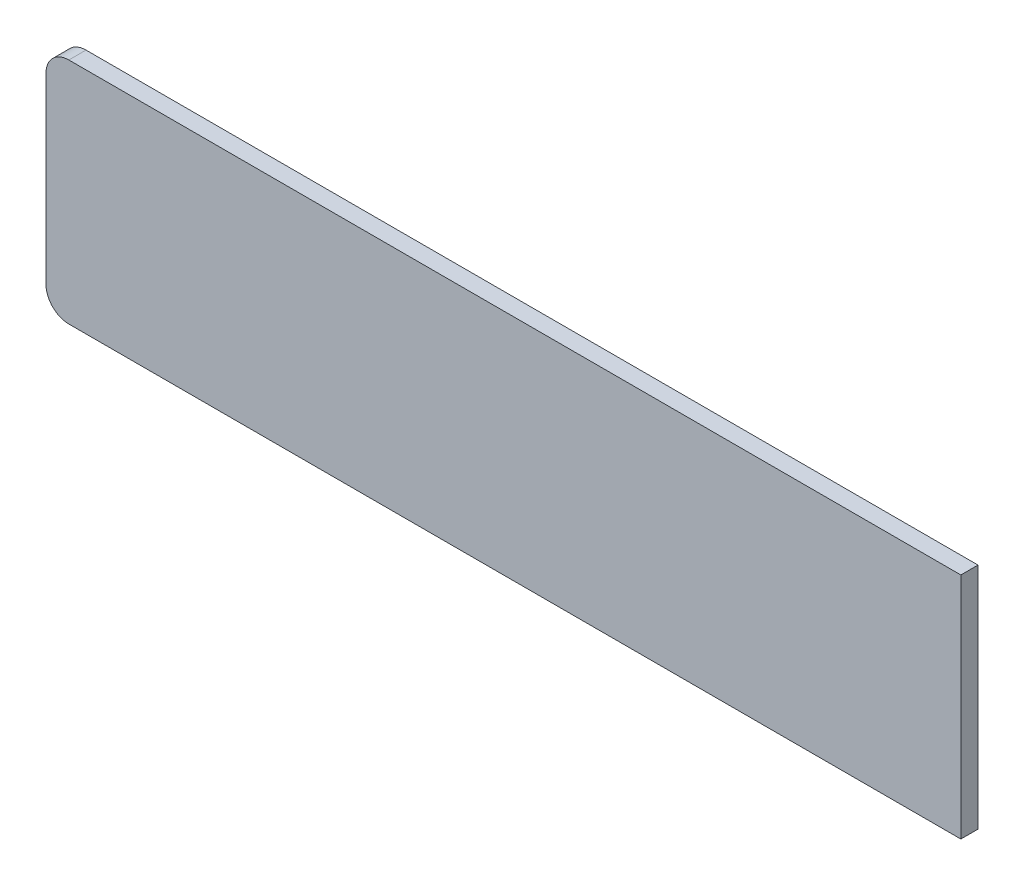
ISO-10303-21;
HEADER;
FILE_DESCRIPTION(('STEP AP214'),'2;1');
FILE_NAME('part.step','',(''),(''),'','','');
FILE_SCHEMA(('AUTOMOTIVE_DESIGN { 1 0 10303 214 1 1 1 1 }'));
ENDSEC;
DATA;
#1=APPLICATION_CONTEXT('core data for automotive mechanical design processes');
#2=APPLICATION_PROTOCOL_DEFINITION('international standard','automotive_design',2000,#1);
#3=PRODUCT_CONTEXT('',#1,'mechanical');
#4=PRODUCT('Part','Part','',(#3));
#5=PRODUCT_RELATED_PRODUCT_CATEGORY('part','',(#4));
#6=PRODUCT_DEFINITION_FORMATION('','',#4);
#7=PRODUCT_DEFINITION_CONTEXT('part definition',#1,'design');
#8=PRODUCT_DEFINITION('design','',#6,#7);
#9=PRODUCT_DEFINITION_SHAPE('','',#8);
#10=(LENGTH_UNIT() NAMED_UNIT(*) SI_UNIT(.MILLI.,.METRE.));
#11=(NAMED_UNIT(*) PLANE_ANGLE_UNIT() SI_UNIT($,.RADIAN.));
#12=(NAMED_UNIT(*) SI_UNIT($,.STERADIAN.) SOLID_ANGLE_UNIT());
#13=UNCERTAINTY_MEASURE_WITH_UNIT(LENGTH_MEASURE(1.E-05),#10,'distance_accuracy_value','');
#14=(GEOMETRIC_REPRESENTATION_CONTEXT(3) GLOBAL_UNCERTAINTY_ASSIGNED_CONTEXT((#13)) GLOBAL_UNIT_ASSIGNED_CONTEXT((#10,
#11,#12)) REPRESENTATION_CONTEXT('',''));
#15=CARTESIAN_POINT('',(0.,0.,0.));
#16=DIRECTION('',(0.,0.,1.));
#17=DIRECTION('',(1.,0.,0.));
#18=AXIS2_PLACEMENT_3D('',#15,#16,#17);
#19=CARTESIAN_POINT('',(-14.951511498347,44.1656930973387,1.5));
#20=DIRECTION('',(-1.,0.,0.));
#21=DIRECTION('',(0.,0.,1.));
#22=AXIS2_PLACEMENT_3D('',#19,#20,#21);
#23=PLANE('',#22);
#24=DIRECTION('',(0.,1.,0.));
#25=VECTOR('',#24,1.);
#26=CARTESIAN_POINT('',(-14.951511498347,44.1656930973387,0.));
#27=LINE('',#26,#25);
#28=CARTESIAN_POINT('',(-14.951511498347,24.1656930973387,0.));
#29=VERTEX_POINT('',#28);
#30=CARTESIAN_POINT('',(-14.951511498347,44.1656930973387,0.));
#31=VERTEX_POINT('',#30);
#32=EDGE_CURVE('E124',#29,#31,#27,.T.);
#33=ORIENTED_EDGE('',*,*,#32,.T.);
#34=DIRECTION('',(0.,0.,-1.));
#35=VECTOR('',#34,1.);
#36=CARTESIAN_POINT('',(-14.951511498347,44.1656930973387,1.5));
#37=LINE('',#36,#35);
#38=CARTESIAN_POINT('',(-14.951511498347,44.1656930973387,1.5));
#39=VERTEX_POINT('',#38);
#40=EDGE_CURVE('E11',#39,#31,#37,.T.);
#41=ORIENTED_EDGE('',*,*,#40,.F.);
#42=DIRECTION('',(0.,1.,0.));
#43=VECTOR('',#42,1.);
#44=CARTESIAN_POINT('',(-14.951511498347,44.1656930973387,1.5));
#45=LINE('',#44,#43);
#46=CARTESIAN_POINT('',(-14.951511498347,24.1656930973387,1.5));
#47=VERTEX_POINT('',#46);
#48=EDGE_CURVE('E134',#47,#39,#45,.T.);
#49=ORIENTED_EDGE('',*,*,#48,.F.);
#50=DIRECTION('',(0.,0.,-1.));
#51=VECTOR('',#50,1.);
#52=CARTESIAN_POINT('',(-14.951511498347,24.1656930973387,1.5));
#53=LINE('',#52,#51);
#54=EDGE_CURVE('E120',#47,#29,#53,.T.);
#55=ORIENTED_EDGE('',*,*,#54,.T.);
#56=EDGE_LOOP('',(#33,#41,#49,#55));
#57=FACE_BOUND('',#56,.T.);
#58=ADVANCED_FACE('F40',(#57),#23,.F.);
#59=CARTESIAN_POINT('',(-92.9515114983469,44.1656930973387,1.5));
#60=DIRECTION('',(0.,-1.,0.));
#61=DIRECTION('',(0.,0.,-1.));
#62=AXIS2_PLACEMENT_3D('',#59,#60,#61);
#63=PLANE('',#62);
#64=DIRECTION('',(-1.,0.,0.));
#65=VECTOR('',#64,1.);
#66=CARTESIAN_POINT('',(-92.9515114983469,44.1656930973387,0.));
#67=LINE('',#66,#65);
#68=CARTESIAN_POINT('',(-92.9515114983469,44.1656930973387,0.));
#69=VERTEX_POINT('',#68);
#70=EDGE_CURVE('E127',#31,#69,#67,.T.);
#71=ORIENTED_EDGE('',*,*,#70,.T.);
#72=DIRECTION('',(0.,0.,-1.));
#73=VECTOR('',#72,1.);
#74=CARTESIAN_POINT('',(-92.9515114983469,44.1656930973387,1.5));
#75=LINE('',#74,#73);
#76=CARTESIAN_POINT('',(-92.9515114983469,44.1656930973387,1.5));
#77=VERTEX_POINT('',#76);
#78=EDGE_CURVE('E48',#77,#69,#75,.T.);
#79=ORIENTED_EDGE('',*,*,#78,.F.);
#80=DIRECTION('',(-1.,0.,0.));
#81=VECTOR('',#80,1.);
#82=CARTESIAN_POINT('',(-92.9515114983469,44.1656930973387,1.5));
#83=LINE('',#82,#81);
#84=EDGE_CURVE('E93',#39,#77,#83,.T.);
#85=ORIENTED_EDGE('',*,*,#84,.F.);
#86=ORIENTED_EDGE('',*,*,#40,.T.);
#87=EDGE_LOOP('',(#71,#79,#85,#86));
#88=FACE_BOUND('',#87,.T.);
#89=ADVANCED_FACE('F158',(#88),#63,.F.);
#90=CARTESIAN_POINT('',(-92.951511498347,42.1656930973387,1.5));
#91=DIRECTION('',(0.,0.,-1.));
#92=DIRECTION('',(-1.,0.,0.));
#93=AXIS2_PLACEMENT_3D('',#90,#91,#92);
#94=CYLINDRICAL_SURFACE('',#93,2.);
#95=CARTESIAN_POINT('',(-92.951511498347,42.1656930973387,0.));
#96=DIRECTION('',(0.,0.,1.));
#97=DIRECTION('',(1.,0.,0.));
#98=AXIS2_PLACEMENT_3D('',#95,#96,#97);
#99=CIRCLE('',#98,2.);
#100=CARTESIAN_POINT('',(-94.951511498347,42.1656930973387,0.));
#101=VERTEX_POINT('',#100);
#102=EDGE_CURVE('E129',#69,#101,#99,.T.);
#103=ORIENTED_EDGE('',*,*,#102,.T.);
#104=DIRECTION('',(0.,0.,-1.));
#105=VECTOR('',#104,1.);
#106=CARTESIAN_POINT('',(-94.951511498347,42.1656930973387,1.5));
#107=LINE('',#106,#105);
#108=CARTESIAN_POINT('',(-94.951511498347,42.1656930973387,1.5));
#109=VERTEX_POINT('',#108);
#110=EDGE_CURVE('E115',#109,#101,#107,.T.);
#111=ORIENTED_EDGE('',*,*,#110,.F.);
#112=CARTESIAN_POINT('',(-92.951511498347,42.1656930973387,1.5));
#113=DIRECTION('',(0.,0.,1.));
#114=DIRECTION('',(1.,0.,0.));
#115=AXIS2_PLACEMENT_3D('',#112,#113,#114);
#116=CIRCLE('',#115,2.);
#117=EDGE_CURVE('E106',#77,#109,#116,.T.);
#118=ORIENTED_EDGE('',*,*,#117,.F.);
#119=ORIENTED_EDGE('',*,*,#78,.T.);
#120=EDGE_LOOP('',(#103,#111,#118,#119));
#121=FACE_BOUND('',#120,.T.);
#122=ADVANCED_FACE('F140',(#121),#94,.T.);
#123=CARTESIAN_POINT('',(-94.951511498347,42.1656930973387,1.5));
#124=DIRECTION('',(1.,0.,0.));
#125=DIRECTION('',(0.,0.,-1.));
#126=AXIS2_PLACEMENT_3D('',#123,#124,#125);
#127=PLANE('',#126);
#128=DIRECTION('',(0.,-1.,0.));
#129=VECTOR('',#128,1.);
#130=CARTESIAN_POINT('',(-94.951511498347,42.1656930973387,0.));
#131=LINE('',#130,#129);
#132=CARTESIAN_POINT('',(-94.951511498347,26.1656930973387,0.));
#133=VERTEX_POINT('',#132);
#134=EDGE_CURVE('E114',#101,#133,#131,.T.);
#135=ORIENTED_EDGE('',*,*,#134,.T.);
#136=DIRECTION('',(0.,0.,-1.));
#137=VECTOR('',#136,1.);
#138=CARTESIAN_POINT('',(-94.951511498347,26.1656930973387,1.5));
#139=LINE('',#138,#137);
#140=CARTESIAN_POINT('',(-94.951511498347,26.1656930973387,1.5));
#141=VERTEX_POINT('',#140);
#142=EDGE_CURVE('E111',#141,#133,#139,.T.);
#143=ORIENTED_EDGE('',*,*,#142,.F.);
#144=DIRECTION('',(0.,-1.,0.));
#145=VECTOR('',#144,1.);
#146=CARTESIAN_POINT('',(-94.951511498347,42.1656930973387,1.5));
#147=LINE('',#146,#145);
#148=EDGE_CURVE('E100',#109,#141,#147,.T.);
#149=ORIENTED_EDGE('',*,*,#148,.F.);
#150=ORIENTED_EDGE('',*,*,#110,.T.);
#151=EDGE_LOOP('',(#135,#143,#149,#150));
#152=FACE_BOUND('',#151,.T.);
#153=ADVANCED_FACE('F112',(#152),#127,.F.);
#154=CARTESIAN_POINT('',(-92.951511498347,26.1656930973387,1.5));
#155=DIRECTION('',(0.,0.,-1.));
#156=DIRECTION('',(-1.,0.,0.));
#157=AXIS2_PLACEMENT_3D('',#154,#155,#156);
#158=CYLINDRICAL_SURFACE('',#157,2.);
#159=CARTESIAN_POINT('',(-92.951511498347,26.1656930973387,0.));
#160=DIRECTION('',(0.,0.,1.));
#161=DIRECTION('',(-1.,0.,0.));
#162=AXIS2_PLACEMENT_3D('',#159,#160,#161);
#163=CIRCLE('',#162,2.);
#164=CARTESIAN_POINT('',(-92.9515114983469,24.1656930973387,0.));
#165=VERTEX_POINT('',#164);
#166=EDGE_CURVE('E79',#133,#165,#163,.T.);
#167=ORIENTED_EDGE('',*,*,#166,.T.);
#168=DIRECTION('',(0.,0.,-1.));
#169=VECTOR('',#168,1.);
#170=CARTESIAN_POINT('',(-92.9515114983469,24.1656930973387,1.5));
#171=LINE('',#170,#169);
#172=CARTESIAN_POINT('',(-92.9515114983469,24.1656930973387,1.5));
#173=VERTEX_POINT('',#172);
#174=EDGE_CURVE('E116',#173,#165,#171,.T.);
#175=ORIENTED_EDGE('',*,*,#174,.F.);
#176=CARTESIAN_POINT('',(-92.951511498347,26.1656930973387,1.5));
#177=DIRECTION('',(0.,0.,1.));
#178=DIRECTION('',(-1.,0.,0.));
#179=AXIS2_PLACEMENT_3D('',#176,#177,#178);
#180=CIRCLE('',#179,2.);
#181=EDGE_CURVE('E104',#141,#173,#180,.T.);
#182=ORIENTED_EDGE('',*,*,#181,.F.);
#183=ORIENTED_EDGE('',*,*,#142,.T.);
#184=EDGE_LOOP('',(#167,#175,#182,#183));
#185=FACE_BOUND('',#184,.T.);
#186=ADVANCED_FACE('F118',(#185),#158,.T.);
#187=CARTESIAN_POINT('',(-92.9515114983469,24.1656930973387,1.5));
#188=DIRECTION('',(0.,1.,0.));
#189=DIRECTION('',(0.,0.,1.));
#190=AXIS2_PLACEMENT_3D('',#187,#188,#189);
#191=PLANE('',#190);
#192=DIRECTION('',(1.,0.,0.));
#193=VECTOR('',#192,1.);
#194=CARTESIAN_POINT('',(-92.9515114983469,24.1656930973387,0.));
#195=LINE('',#194,#193);
#196=EDGE_CURVE('E85',#165,#29,#195,.T.);
#197=ORIENTED_EDGE('',*,*,#196,.T.);
#198=ORIENTED_EDGE('',*,*,#54,.F.);
#199=DIRECTION('',(1.,0.,0.));
#200=VECTOR('',#199,1.);
#201=CARTESIAN_POINT('',(-92.9515114983469,24.1656930973387,1.5));
#202=LINE('',#201,#200);
#203=EDGE_CURVE('E56',#173,#47,#202,.T.);
#204=ORIENTED_EDGE('',*,*,#203,.F.);
#205=ORIENTED_EDGE('',*,*,#174,.T.);
#206=EDGE_LOOP('',(#197,#198,#204,#205));
#207=FACE_BOUND('',#206,.T.);
#208=ADVANCED_FACE('F147',(#207),#191,.F.);
#209=CARTESIAN_POINT('',(-92.951511498347,26.1656930973387,1.5));
#210=DIRECTION('',(0.,0.,-1.));
#211=DIRECTION('',(-1.,0.,0.));
#212=AXIS2_PLACEMENT_3D('',#209,#210,#211);
#213=PLANE('',#212);
#214=ORIENTED_EDGE('',*,*,#48,.T.);
#215=ORIENTED_EDGE('',*,*,#84,.T.);
#216=ORIENTED_EDGE('',*,*,#117,.T.);
#217=ORIENTED_EDGE('',*,*,#148,.T.);
#218=ORIENTED_EDGE('',*,*,#181,.T.);
#219=ORIENTED_EDGE('',*,*,#203,.T.);
#220=EDGE_LOOP('',(#214,#215,#216,#217,#218,#219));
#221=FACE_BOUND('',#220,.T.);
#222=ADVANCED_FACE('F102',(#221),#213,.F.);
#223=CARTESIAN_POINT('',(-92.951511498347,26.1656930973387,0.));
#224=DIRECTION('',(0.,0.,-1.));
#225=DIRECTION('',(-1.,0.,0.));
#226=AXIS2_PLACEMENT_3D('',#223,#224,#225);
#227=PLANE('',#226);
#228=ORIENTED_EDGE('',*,*,#32,.F.);
#229=ORIENTED_EDGE('',*,*,#196,.F.);
#230=ORIENTED_EDGE('',*,*,#166,.F.);
#231=ORIENTED_EDGE('',*,*,#134,.F.);
#232=ORIENTED_EDGE('',*,*,#102,.F.);
#233=ORIENTED_EDGE('',*,*,#70,.F.);
#234=EDGE_LOOP('',(#228,#229,#230,#231,#232,#233));
#235=FACE_BOUND('',#234,.T.);
#236=ADVANCED_FACE('F143',(#235),#227,.T.);
#237=CLOSED_SHELL('',(#58,#89,#122,#153,#186,#208,#222,#236));
#238=MANIFOLD_SOLID_BREP('B2',#237);
#239=ADVANCED_BREP_SHAPE_REPRESENTATION('',(#18,#238),#14);
#240=SHAPE_DEFINITION_REPRESENTATION(#9,#239);
ENDSEC;
END-ISO-10303-21;
